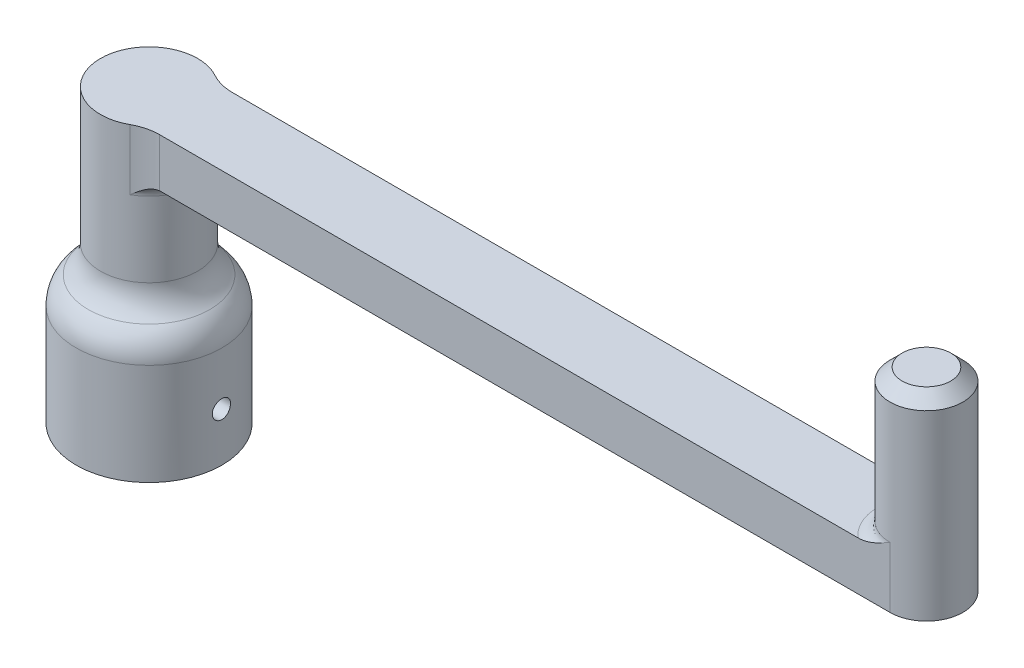
ISO-10303-21;
HEADER;
FILE_DESCRIPTION(('STEP AP214'),'2;1');
FILE_NAME('part.step','',(''),(''),'','','');
FILE_SCHEMA(('AUTOMOTIVE_DESIGN { 1 0 10303 214 1 1 1 1 }'));
ENDSEC;
DATA;
#1=APPLICATION_CONTEXT('core data for automotive mechanical design processes');
#2=APPLICATION_PROTOCOL_DEFINITION('international standard','automotive_design',2000,#1);
#3=PRODUCT_CONTEXT('',#1,'mechanical');
#4=PRODUCT('Part','Part','',(#3));
#5=PRODUCT_RELATED_PRODUCT_CATEGORY('part','',(#4));
#6=PRODUCT_DEFINITION_FORMATION('','',#4);
#7=PRODUCT_DEFINITION_CONTEXT('part definition',#1,'design');
#8=PRODUCT_DEFINITION('design','',#6,#7);
#9=PRODUCT_DEFINITION_SHAPE('','',#8);
#10=(LENGTH_UNIT() NAMED_UNIT(*) SI_UNIT(.MILLI.,.METRE.));
#11=(NAMED_UNIT(*) PLANE_ANGLE_UNIT() SI_UNIT($,.RADIAN.));
#12=(NAMED_UNIT(*) SI_UNIT($,.STERADIAN.) SOLID_ANGLE_UNIT());
#13=UNCERTAINTY_MEASURE_WITH_UNIT(LENGTH_MEASURE(1.E-05),#10,'distance_accuracy_value','');
#14=(GEOMETRIC_REPRESENTATION_CONTEXT(3) GLOBAL_UNCERTAINTY_ASSIGNED_CONTEXT((#13)) GLOBAL_UNIT_ASSIGNED_CONTEXT((#10,
#11,#12)) REPRESENTATION_CONTEXT('',''));
#15=CARTESIAN_POINT('',(0.,0.,0.));
#16=DIRECTION('',(0.,0.,1.));
#17=DIRECTION('',(1.,0.,0.));
#18=AXIS2_PLACEMENT_3D('',#15,#16,#17);
#19=CARTESIAN_POINT('',(0.,38.1,0.));
#20=DIRECTION('',(0.,-1.,0.));
#21=DIRECTION('',(0.,0.,-1.));
#22=AXIS2_PLACEMENT_3D('',#19,#20,#21);
#23=CYLINDRICAL_SURFACE('',#22,6.35);
#24=CARTESIAN_POINT('',(0.,20.3651280605346,0.));
#25=DIRECTION('',(0.,-1.,0.));
#26=DIRECTION('',(0.,0.,-1.));
#27=AXIS2_PLACEMENT_3D('',#24,#25,#26);
#28=CIRCLE('',#27,6.35);
#29=CARTESIAN_POINT('',(0.,20.3651280605346,-6.35));
#30=VERTEX_POINT('',#29);
#31=EDGE_CURVE('E197',#30,#30,#28,.F.);
#32=ORIENTED_EDGE('',*,*,#31,.T.);
#33=EDGE_LOOP('',(#32));
#34=FACE_BOUND('',#33,.T.);
#35=DIRECTION('',(0.,-1.,0.));
#36=VECTOR('',#35,1.);
#37=CARTESIAN_POINT('',(3.07418053105214,38.1,-5.55625));
#38=LINE('',#37,#36);
#39=CARTESIAN_POINT('',(3.07418053105214,38.1,-5.55625));
#40=VERTEX_POINT('',#39);
#41=CARTESIAN_POINT('',(3.07418053105214,30.1625,-5.55625));
#42=VERTEX_POINT('',#41);
#43=EDGE_CURVE('E201',#40,#42,#38,.T.);
#44=ORIENTED_EDGE('',*,*,#43,.T.);
#45=CARTESIAN_POINT('',(0.,30.1625,0.));
#46=DIRECTION('',(0.,1.,0.));
#47=DIRECTION('',(0.,0.,1.));
#48=AXIS2_PLACEMENT_3D('',#45,#46,#47);
#49=CIRCLE('',#48,6.35);
#50=CARTESIAN_POINT('',(3.07418053105214,30.1625,5.55625));
#51=VERTEX_POINT('',#50);
#52=EDGE_CURVE('E204',#42,#51,#49,.F.);
#53=ORIENTED_EDGE('',*,*,#52,.T.);
#54=DIRECTION('',(0.,-1.,0.));
#55=VECTOR('',#54,1.);
#56=CARTESIAN_POINT('',(3.07418053105214,38.1,5.55625));
#57=LINE('',#56,#55);
#58=CARTESIAN_POINT('',(3.07418053105214,38.1,5.55625));
#59=VERTEX_POINT('',#58);
#60=EDGE_CURVE('E208',#51,#59,#57,.F.);
#61=ORIENTED_EDGE('',*,*,#60,.T.);
#62=CARTESIAN_POINT('',(0.,38.1,0.));
#63=DIRECTION('',(0.,1.,0.));
#64=DIRECTION('',(0.,0.,1.));
#65=AXIS2_PLACEMENT_3D('',#62,#63,#64);
#66=CIRCLE('',#65,6.35);
#67=EDGE_CURVE('E207',#40,#59,#66,.T.);
#68=ORIENTED_EDGE('',*,*,#67,.F.);
#69=EDGE_LOOP('',(#44,#53,#61,#68));
#70=FACE_BOUND('',#69,.T.);
#71=ADVANCED_FACE('F29',(#34,#70),#23,.T.);
#72=CARTESIAN_POINT('',(0.,0.,0.));
#73=DIRECTION('',(0.,1.,0.));
#74=DIRECTION('',(0.,0.,1.));
#75=AXIS2_PLACEMENT_3D('',#72,#73,#74);
#76=PLANE('',#75);
#77=CARTESIAN_POINT('',(0.,0.,0.));
#78=DIRECTION('',(0.,1.,0.));
#79=DIRECTION('',(0.,0.,1.));
#80=AXIS2_PLACEMENT_3D('',#77,#78,#79);
#81=CIRCLE('',#80,9.525);
#82=CARTESIAN_POINT('',(0.,0.,9.525));
#83=VERTEX_POINT('',#82);
#84=EDGE_CURVE('E305',#83,#83,#81,.T.);
#85=ORIENTED_EDGE('',*,*,#84,.F.);
#86=EDGE_LOOP('',(#85));
#87=FACE_BOUND('',#86,.T.);
#88=CARTESIAN_POINT('',(0.,0.,0.));
#89=DIRECTION('',(0.,1.,0.));
#90=DIRECTION('',(0.,0.,1.));
#91=AXIS2_PLACEMENT_3D('',#88,#89,#90);
#92=CIRCLE('',#91,6.35);
#93=CARTESIAN_POINT('',(4.7625,0.,-4.20013020631504));
#94=VERTEX_POINT('',#93);
#95=CARTESIAN_POINT('',(4.7625,0.,4.20013020631504));
#96=VERTEX_POINT('',#95);
#97=EDGE_CURVE('E150',#94,#96,#92,.T.);
#98=ORIENTED_EDGE('',*,*,#97,.T.);
#99=DIRECTION('',(0.,0.,-1.));
#100=VECTOR('',#99,1.);
#101=CARTESIAN_POINT('',(4.7625,0.,4.20013020631504));
#102=LINE('',#101,#100);
#103=EDGE_CURVE('E318',#96,#94,#102,.T.);
#104=ORIENTED_EDGE('',*,*,#103,.T.);
#105=EDGE_LOOP('',(#98,#104));
#106=FACE_BOUND('',#105,.T.);
#107=ADVANCED_FACE('F188',(#87,#106),#76,.F.);
#108=CARTESIAN_POINT('',(0.,38.1,0.));
#109=DIRECTION('',(0.,1.,0.));
#110=DIRECTION('',(0.,0.,1.));
#111=AXIS2_PLACEMENT_3D('',#108,#109,#110);
#112=PLANE('',#111);
#113=DIRECTION('',(1.,0.,0.));
#114=VECTOR('',#113,1.);
#115=CARTESIAN_POINT('',(0.,38.1,4.7625));
#116=LINE('',#115,#114);
#117=CARTESIAN_POINT('',(6.14836106210427,38.1,4.7625));
#118=VERTEX_POINT('',#117);
#119=CARTESIAN_POINT('',(97.3998697936849,38.1,4.76250000000001));
#120=VERTEX_POINT('',#119);
#121=EDGE_CURVE('E121',#118,#120,#116,.T.);
#122=ORIENTED_EDGE('',*,*,#121,.T.);
#123=CARTESIAN_POINT('',(101.6,38.1,0.));
#124=DIRECTION('',(0.,1.,0.));
#125=DIRECTION('',(0.,0.,1.));
#126=AXIS2_PLACEMENT_3D('',#123,#124,#125);
#127=CIRCLE('',#126,6.35);
#128=CARTESIAN_POINT('',(97.3998697936849,38.1,-4.76249999999999));
#129=VERTEX_POINT('',#128);
#130=EDGE_CURVE('E222',#120,#129,#127,.F.);
#131=ORIENTED_EDGE('',*,*,#130,.T.);
#132=DIRECTION('',(1.,0.,0.));
#133=VECTOR('',#132,1.);
#134=CARTESIAN_POINT('',(0.,38.1,-4.7625));
#135=LINE('',#134,#133);
#136=CARTESIAN_POINT('',(6.14836106210427,38.1,-4.7625));
#137=VERTEX_POINT('',#136);
#138=EDGE_CURVE('E285',#137,#129,#135,.T.);
#139=ORIENTED_EDGE('',*,*,#138,.F.);
#140=CARTESIAN_POINT('',(6.14836106210427,38.1,-11.1125));
#141=DIRECTION('',(0.,1.,0.));
#142=DIRECTION('',(0.,0.,1.));
#143=AXIS2_PLACEMENT_3D('',#140,#141,#142);
#144=CIRCLE('',#143,6.35);
#145=EDGE_CURVE('E280',#137,#40,#144,.F.);
#146=ORIENTED_EDGE('',*,*,#145,.T.);
#147=ORIENTED_EDGE('',*,*,#67,.T.);
#148=CARTESIAN_POINT('',(6.14836106210427,38.1,11.1125));
#149=DIRECTION('',(0.,1.,0.));
#150=DIRECTION('',(0.,0.,1.));
#151=AXIS2_PLACEMENT_3D('',#148,#149,#150);
#152=CIRCLE('',#151,6.35);
#153=EDGE_CURVE('E293',#59,#118,#152,.F.);
#154=ORIENTED_EDGE('',*,*,#153,.T.);
#155=EDGE_LOOP('',(#122,#131,#139,#146,#147,#154));
#156=FACE_BOUND('',#155,.T.);
#157=ADVANCED_FACE('F185',(#156),#112,.T.);
#158=CARTESIAN_POINT('',(0.,15.875,0.));
#159=DIRECTION('',(0.,-1.,0.));
#160=DIRECTION('',(0.,0.,-1.));
#161=AXIS2_PLACEMENT_3D('',#158,#159,#160);
#162=CYLINDRICAL_SURFACE('',#161,9.525);
#163=CARTESIAN_POINT('',(9.525,5.159375,0.));
#164=CARTESIAN_POINT('',(9.52499907081924,5.15937782937064,0.0665993217584333));
#165=CARTESIAN_POINT('',(9.52429412394272,5.16498183370437,0.133240259761685));
#166=CARTESIAN_POINT('',(9.52154975978035,5.18724884311434,0.264667746995247));
#167=CARTESIAN_POINT('',(9.51950894913981,5.20392339543601,0.32945228620956));
#168=CARTESIAN_POINT('',(9.51432276572398,5.24783255291408,0.455245267504719));
#169=CARTESIAN_POINT('',(9.51117813655702,5.27506005016194,0.5162562192696));
#170=CARTESIAN_POINT('',(9.50413406293194,5.33928666899061,0.63283122491781));
#171=CARTESIAN_POINT('',(9.5002347479881,5.37628411431275,0.688396210941223));
#172=CARTESIAN_POINT('',(9.49209265522138,5.4592181661111,0.792819479063541));
#173=CARTESIAN_POINT('',(9.48784828372264,5.50519780785114,0.841643461301308));
#174=CARTESIAN_POINT('',(9.47950729512144,5.60469866970932,0.930903392931758));
#175=CARTESIAN_POINT('',(9.47541068555933,5.65822027401493,0.971338914756811));
#176=CARTESIAN_POINT('',(9.46781335551327,5.77150863931565,1.04280183931148));
#177=CARTESIAN_POINT('',(9.4643146875598,5.83129581844673,1.07379711069194));
#178=CARTESIAN_POINT('',(9.45833037427971,5.95527783348993,1.1252944902189));
#179=CARTESIAN_POINT('',(9.45584469053881,6.01947250215377,1.14579699627856));
#180=CARTESIAN_POINT('',(9.45218299236221,6.1500912981482,1.1756226392368));
#181=CARTESIAN_POINT('',(9.45100019611749,6.21650200898162,1.18500368539097));
#182=CARTESIAN_POINT('',(9.45005743403004,6.34996488297846,1.19249930547663));
#183=CARTESIAN_POINT('',(9.45029741096968,6.41701702023828,1.1906143324774));
#184=CARTESIAN_POINT('',(9.45216687494844,6.54945579897723,1.17567895885832));
#185=CARTESIAN_POINT('',(9.45378842328606,6.61484976217788,1.16269234837146));
#186=CARTESIAN_POINT('',(9.45822593884571,6.74252287885554,1.12602186999045));
#187=CARTESIAN_POINT('',(9.46104193026775,6.80480196919506,1.10233778535935));
#188=CARTESIAN_POINT('',(9.4675600393054,6.92467563453408,1.04487609790793));
#189=CARTESIAN_POINT('',(9.4712645849195,6.98225678424358,1.01107077457826));
#190=CARTESIAN_POINT('',(9.47914051318822,7.09095293821431,0.93434604982886));
#191=CARTESIAN_POINT('',(9.48331191719172,7.14206764654496,0.891426231533472));
#192=CARTESIAN_POINT('',(9.49168683585315,7.23675021598171,0.79733732649649));
#193=CARTESIAN_POINT('',(9.49589037311756,7.28026345495355,0.746113256233808));
#194=CARTESIAN_POINT('',(9.50382893754725,7.35808260411455,0.637059226790508));
#195=CARTESIAN_POINT('',(9.50756396363217,7.39238849307254,0.57922925237782));
#196=CARTESIAN_POINT('',(9.51414698744098,7.45081916637094,0.45856287098686));
#197=CARTESIAN_POINT('',(9.51699468708732,7.47494053041093,0.39572479052959));
#198=CARTESIAN_POINT('',(9.52147949227754,7.51227407254045,0.266846656630293));
#199=CARTESIAN_POINT('',(9.52311665449633,7.52548676135527,0.200806753245358));
#200=CARTESIAN_POINT('',(9.52498855290624,7.54055709830409,0.0678718943138055));
#201=CARTESIAN_POINT('',(9.5252325821293,7.54248999136339,0.000985594707089094));
#202=CARTESIAN_POINT('',(9.52431580975086,7.53514444165585,-0.13215748738193));
#203=CARTESIAN_POINT('',(9.52315503806674,7.52586623764643,-0.198414283240189));
#204=CARTESIAN_POINT('',(9.51956488620374,7.4964243761962,-0.328195546802372));
#205=CARTESIAN_POINT('',(9.51713968812605,7.4762965964295,-0.391728279164763));
#206=CARTESIAN_POINT('',(9.51129220626469,7.42576423852647,-0.514516523126314));
#207=CARTESIAN_POINT('',(9.50786988862572,7.39535931144346,-0.573771889410353));
#208=CARTESIAN_POINT('',(9.50038655660941,7.32495369326207,-0.686659402977384));
#209=CARTESIAN_POINT('',(9.49632233975245,7.28490432948007,-0.740260978173241));
#210=CARTESIAN_POINT('',(9.48801986532594,7.19641555179934,-0.840008316309531));
#211=CARTESIAN_POINT('',(9.4837816008531,7.14797580486547,-0.886153783157926));
#212=CARTESIAN_POINT('',(9.47558003976556,7.04374984276941,-0.969945970387077));
#213=CARTESIAN_POINT('',(9.47161844586032,6.98792337506968,-1.00754281309548));
#214=CARTESIAN_POINT('',(9.46444677006442,6.87070401088794,-1.07282593859747));
#215=CARTESIAN_POINT('',(9.46123667310901,6.80931122602431,-1.10051242006313));
#216=CARTESIAN_POINT('',(9.45594303749664,6.68286287925595,-1.14510815818519));
#217=CARTESIAN_POINT('',(9.45385656144256,6.61781736343965,-1.16204553632645));
#218=CARTESIAN_POINT('',(9.45103797450925,6.48577769209946,-1.18475283457956));
#219=CARTESIAN_POINT('',(9.4503058006243,6.41878362737453,-1.19052327420765));
#220=CARTESIAN_POINT('',(9.45028055162894,6.28524479746627,-1.1907233628104));
#221=CARTESIAN_POINT('',(9.45097753288118,6.21870013798194,-1.18523137240428));
#222=CARTESIAN_POINT('',(9.45371068298342,6.08748760464941,-1.16322843530949));
#223=CARTESIAN_POINT('',(9.45574685197692,6.02281973100231,-1.14671748744012));
#224=CARTESIAN_POINT('',(9.46092587637629,5.89720676184,-1.1031698188447));
#225=CARTESIAN_POINT('',(9.46406833493563,5.83626034055836,-1.07613687218741));
#226=CARTESIAN_POINT('',(9.47110651770345,5.71975615600949,-1.01232028714908));
#227=CARTESIAN_POINT('',(9.47500225135022,5.66419846027431,-0.97553652659144));
#228=CARTESIAN_POINT('',(9.48314050513251,5.5596482539316,-0.892971765265354));
#229=CARTESIAN_POINT('',(9.48738516580021,5.51070202422019,-0.847132366775322));
#230=CARTESIAN_POINT('',(9.49572411046119,5.42116637451375,-0.747879295593691));
#231=CARTESIAN_POINT('',(9.49981835876249,5.38057892761873,-0.69446383957867));
#232=CARTESIAN_POINT('',(9.50741235699438,5.3087815986786,-0.581342001931816));
#233=CARTESIAN_POINT('',(9.51090978693541,5.27760796494048,-0.521612469407674));
#234=CARTESIAN_POINT('',(9.5168925537279,5.22577794556112,-0.397755857220983));
#235=CARTESIAN_POINT('',(9.5193789896976,5.20511013219917,-0.333633642264448));
#236=CARTESIAN_POINT('',(9.52246025556089,5.17982549019592,-0.224316498899723));
#237=CARTESIAN_POINT('',(9.5234080195771,5.17216757888104,-0.179810884749932));
#238=CARTESIAN_POINT('',(9.52467820420526,5.1619413942386,-0.0902098763549205));
#239=CARTESIAN_POINT('',(9.52500062942852,5.15937308337983,-0.0451144864612313));
#240=CARTESIAN_POINT('',(9.525,5.159375,0.));
#241=B_SPLINE_CURVE_WITH_KNOTS('',3,(#163,#164,#165,#166,#167,#168,#169,#170,#171,#172,#173,
#174,#175,#176,#177,#178,#179,#180,#181,#182,#183,#184,#185,#186,#187,#188,#189,#190,#191,#192,
#193,#194,#195,#196,#197,#198,#199,#200,#201,#202,#203,#204,#205,#206,#207,#208,#209,#210,#211,
#212,#213,#214,#215,#216,#217,#218,#219,#220,#221,#222,#223,#224,#225,#226,#227,#228,#229,#230,
#231,#232,#233,#234,#235,#236,#237,#238,#239,#240),.UNSPECIFIED.,.T.,.F.,(4,2,2,2,2,2,2,2,2,2,2,
2,2,2,2,2,2,2,2,2,2,2,2,2,2,2,2,2,2,2,2,2,2,2,2,2,2,2,4),(0.,0.199633176159688,
0.399474909524307,0.599182273271568,0.798855394877485,0.999509747873776,1.20017432589755,
1.40151445464362,1.60284694747854,1.8031264354261,2.00339786907571,2.20252621680356,
2.40165859916672,2.60134144268485,2.8010334211962,3.00210606462468,3.2031791717012,
3.40431975217177,3.60545091505425,3.80523883060402,4.00502249144044,4.2041495191673,
4.40328330866349,4.60344394394661,4.80361252592386,5.00492063930482,5.20622471685508,
5.4069999537629,5.60776584983809,5.80713961697555,6.00651340547635,6.20581574766465,
6.40512058720716,6.60575531950734,6.80643735771344,7.00788255696301,7.20910816248271,
7.34434099068108,7.47957282165583),.UNSPECIFIED.);
#242=CARTESIAN_POINT('',(9.525,5.159375,0.));
#243=VERTEX_POINT('',#242);
#244=EDGE_CURVE('E143',#243,#243,#241,.T.);
#245=ORIENTED_EDGE('',*,*,#244,.T.);
#246=EDGE_LOOP('',(#245));
#247=FACE_BOUND('',#246,.T.);
#248=CARTESIAN_POINT('',(0.,13.2656122319727,0.));
#249=DIRECTION('',(0.,-1.,0.));
#250=DIRECTION('',(0.,0.,-1.));
#251=AXIS2_PLACEMENT_3D('',#248,#249,#250);
#252=CIRCLE('',#251,9.525);
#253=CARTESIAN_POINT('',(0.,13.2656122319727,-9.525));
#254=VERTEX_POINT('',#253);
#255=EDGE_CURVE('E209',#254,#254,#252,.T.);
#256=ORIENTED_EDGE('',*,*,#255,.T.);
#257=EDGE_LOOP('',(#256));
#258=FACE_BOUND('',#257,.T.);
#259=ORIENTED_EDGE('',*,*,#84,.T.);
#260=EDGE_LOOP('',(#259));
#261=FACE_BOUND('',#260,.T.);
#262=ADVANCED_FACE('F152',(#247,#258,#261),#162,.T.);
#263=CARTESIAN_POINT('',(0.,12.7,0.));
#264=DIRECTION('',(0.,-1.,0.));
#265=DIRECTION('',(0.,0.,-1.));
#266=AXIS2_PLACEMENT_3D('',#263,#264,#265);
#267=CYLINDRICAL_SURFACE('',#266,6.35);
#268=ORIENTED_EDGE('',*,*,#97,.F.);
#269=DIRECTION('',(0.,-1.,0.));
#270=VECTOR('',#269,1.);
#271=CARTESIAN_POINT('',(4.7625,12.7,-4.20013020631504));
#272=LINE('',#271,#270);
#273=CARTESIAN_POINT('',(4.7625,12.7,-4.20013020631504));
#274=VERTEX_POINT('',#273);
#275=EDGE_CURVE('E311',#274,#94,#272,.T.);
#276=ORIENTED_EDGE('',*,*,#275,.F.);
#277=CARTESIAN_POINT('',(0.,12.7,0.));
#278=DIRECTION('',(0.,1.,0.));
#279=DIRECTION('',(0.,0.,1.));
#280=AXIS2_PLACEMENT_3D('',#277,#278,#279);
#281=CIRCLE('',#280,6.35);
#282=CARTESIAN_POINT('',(4.7625,12.7,4.20013020631504));
#283=VERTEX_POINT('',#282);
#284=EDGE_CURVE('E316',#274,#283,#281,.T.);
#285=ORIENTED_EDGE('',*,*,#284,.T.);
#286=DIRECTION('',(0.,-1.,0.));
#287=VECTOR('',#286,1.);
#288=CARTESIAN_POINT('',(4.7625,12.7,4.20013020631504));
#289=LINE('',#288,#287);
#290=EDGE_CURVE('E308',#283,#96,#289,.T.);
#291=ORIENTED_EDGE('',*,*,#290,.T.);
#292=EDGE_LOOP('',(#268,#276,#285,#291));
#293=FACE_BOUND('',#292,.T.);
#294=ADVANCED_FACE('F178',(#293),#267,.F.);
#295=CARTESIAN_POINT('',(4.7625,12.7,4.20013020631504));
#296=DIRECTION('',(-1.,0.,0.));
#297=DIRECTION('',(0.,0.,1.));
#298=AXIS2_PLACEMENT_3D('',#295,#296,#297);
#299=PLANE('',#298);
#300=CARTESIAN_POINT('',(4.7625,6.35,0.));
#301=DIRECTION('',(-1.,0.,0.));
#302=DIRECTION('',(0.,0.,1.));
#303=AXIS2_PLACEMENT_3D('',#300,#301,#302);
#304=CIRCLE('',#303,1.190625);
#305=CARTESIAN_POINT('',(4.7625,6.35,1.190625));
#306=VERTEX_POINT('',#305);
#307=EDGE_CURVE('E132',#306,#306,#304,.T.);
#308=ORIENTED_EDGE('',*,*,#307,.F.);
#309=EDGE_LOOP('',(#308));
#310=FACE_BOUND('',#309,.T.);
#311=ORIENTED_EDGE('',*,*,#103,.F.);
#312=ORIENTED_EDGE('',*,*,#290,.F.);
#313=DIRECTION('',(0.,0.,-1.));
#314=VECTOR('',#313,1.);
#315=CARTESIAN_POINT('',(4.7625,12.7,4.20013020631504));
#316=LINE('',#315,#314);
#317=EDGE_CURVE('E314',#283,#274,#316,.T.);
#318=ORIENTED_EDGE('',*,*,#317,.T.);
#319=ORIENTED_EDGE('',*,*,#275,.T.);
#320=EDGE_LOOP('',(#311,#312,#318,#319));
#321=FACE_BOUND('',#320,.T.);
#322=ADVANCED_FACE('F175',(#310,#321),#299,.T.);
#323=CARTESIAN_POINT('',(0.,12.7,0.));
#324=DIRECTION('',(0.,1.,0.));
#325=DIRECTION('',(0.,0.,1.));
#326=AXIS2_PLACEMENT_3D('',#323,#324,#325);
#327=PLANE('',#326);
#328=ORIENTED_EDGE('',*,*,#284,.F.);
#329=ORIENTED_EDGE('',*,*,#317,.F.);
#330=EDGE_LOOP('',(#328,#329));
#331=FACE_BOUND('',#330,.T.);
#332=ADVANCED_FACE('F171',(#331),#327,.F.);
#333=CARTESIAN_POINT('',(0.,20.3651280605346,0.));
#334=DIRECTION('',(0.,-1.,0.));
#335=DIRECTION('',(0.,0.,-1.));
#336=AXIS2_PLACEMENT_3D('',#333,#334,#335);
#337=TOROIDAL_SURFACE('',#336,11.1125,4.7625);
#338=CARTESIAN_POINT('',(0.,16.8153701462537,0.));
#339=DIRECTION('',(0.,1.,0.));
#340=DIRECTION('',(0.,0.,1.));
#341=AXIS2_PLACEMENT_3D('',#338,#339,#340);
#342=CIRCLE('',#341,7.9375);
#343=CARTESIAN_POINT('',(0.,16.8153701462537,7.9375));
#344=VERTEX_POINT('',#343);
#345=EDGE_CURVE('E300',#344,#344,#342,.T.);
#346=ORIENTED_EDGE('',*,*,#345,.T.);
#347=EDGE_LOOP('',(#346));
#348=FACE_BOUND('',#347,.T.);
#349=ORIENTED_EDGE('',*,*,#31,.F.);
#350=EDGE_LOOP('',(#349));
#351=FACE_BOUND('',#350,.T.);
#352=ADVANCED_FACE('F167',(#348,#351),#337,.F.);
#353=CARTESIAN_POINT('',(0.,13.2656122319727,0.));
#354=DIRECTION('',(0.,-1.,0.));
#355=DIRECTION('',(0.,0.,-1.));
#356=AXIS2_PLACEMENT_3D('',#353,#354,#355);
#357=DEGENERATE_TOROIDAL_SURFACE('',#356,4.7625,4.7625,.T.);
#358=ORIENTED_EDGE('',*,*,#255,.F.);
#359=EDGE_LOOP('',(#358));
#360=FACE_BOUND('',#359,.T.);
#361=ORIENTED_EDGE('',*,*,#345,.F.);
#362=EDGE_LOOP('',(#361));
#363=FACE_BOUND('',#362,.T.);
#364=ADVANCED_FACE('F161',(#360,#363),#357,.T.);
#365=CARTESIAN_POINT('',(9.525,6.35,0.));
#366=DIRECTION('',(-1.,0.,0.));
#367=DIRECTION('',(0.,0.,1.));
#368=AXIS2_PLACEMENT_3D('',#365,#366,#367);
#369=CYLINDRICAL_SURFACE('',#368,1.190625);
#370=ORIENTED_EDGE('',*,*,#307,.T.);
#371=EDGE_LOOP('',(#370));
#372=FACE_BOUND('',#371,.T.);
#373=ORIENTED_EDGE('',*,*,#244,.F.);
#374=EDGE_LOOP('',(#373));
#375=FACE_BOUND('',#374,.T.);
#376=ADVANCED_FACE('F156',(#372,#375),#369,.F.);
#377=CARTESIAN_POINT('',(101.6,31.75,0.));
#378=DIRECTION('',(0.,1.,0.));
#379=DIRECTION('',(0.,0.,1.));
#380=AXIS2_PLACEMENT_3D('',#377,#378,#379);
#381=PLANE('',#380);
#382=DIRECTION('',(1.,0.,0.));
#383=VECTOR('',#382,1.);
#384=CARTESIAN_POINT('',(0.,31.75,4.7625));
#385=LINE('',#384,#383);
#386=CARTESIAN_POINT('',(6.35,31.75,4.7625));
#387=VERTEX_POINT('',#386);
#388=CARTESIAN_POINT('',(101.6,31.75,4.76250000000001));
#389=VERTEX_POINT('',#388);
#390=EDGE_CURVE('E137',#387,#389,#385,.T.);
#391=ORIENTED_EDGE('',*,*,#390,.F.);
#392=CARTESIAN_POINT('',(0.,31.75,0.));
#393=DIRECTION('',(0.,1.,0.));
#394=DIRECTION('',(0.,0.,1.));
#395=AXIS2_PLACEMENT_3D('',#392,#393,#394);
#396=CIRCLE('',#395,7.9375);
#397=CARTESIAN_POINT('',(6.35,31.75,-4.7625));
#398=VERTEX_POINT('',#397);
#399=EDGE_CURVE('E119',#387,#398,#396,.T.);
#400=ORIENTED_EDGE('',*,*,#399,.T.);
#401=DIRECTION('',(1.,0.,0.));
#402=VECTOR('',#401,1.);
#403=CARTESIAN_POINT('',(0.,31.75,-4.7625));
#404=LINE('',#403,#402);
#405=CARTESIAN_POINT('',(101.6,31.75,-4.76249999999999));
#406=VERTEX_POINT('',#405);
#407=EDGE_CURVE('E112',#398,#406,#404,.T.);
#408=ORIENTED_EDGE('',*,*,#407,.T.);
#409=CARTESIAN_POINT('',(101.6,31.75,0.));
#410=DIRECTION('',(0.,1.,0.));
#411=DIRECTION('',(0.,0.,1.));
#412=AXIS2_PLACEMENT_3D('',#409,#410,#411);
#413=CIRCLE('',#412,4.7625);
#414=EDGE_CURVE('E117',#389,#406,#413,.T.);
#415=ORIENTED_EDGE('',*,*,#414,.F.);
#416=EDGE_LOOP('',(#391,#400,#408,#415));
#417=FACE_BOUND('',#416,.T.);
#418=ADVANCED_FACE('F115',(#417),#381,.F.);
#419=CARTESIAN_POINT('',(0.,31.75,-4.7625));
#420=DIRECTION('',(0.,0.,1.));
#421=DIRECTION('',(1.,0.,0.));
#422=AXIS2_PLACEMENT_3D('',#419,#420,#421);
#423=PLANE('',#422);
#424=ORIENTED_EDGE('',*,*,#407,.F.);
#425=CARTESIAN_POINT('',(6.35,31.75,-4.7625));
#426=CARTESIAN_POINT('',(6.31633922220832,31.7499923867917,-4.7625));
#427=CARTESIAN_POINT('',(6.28270554805562,31.7493118181252,-4.7625));
#428=CARTESIAN_POINT('',(6.21549256901834,31.7466047763999,-4.7625));
#429=CARTESIAN_POINT('',(6.18191326387246,31.7445783098287,-4.7625));
#430=CARTESIAN_POINT('',(6.14836106210427,31.7418788942867,-4.7625));
#431=B_SPLINE_CURVE_WITH_KNOTS('',3,(#425,#426,#427,#428,#429,#430),.UNSPECIFIED.,.F.,.F.,(4,2,
4),(0.,0.100921677039571,0.201842867617153),.UNSPECIFIED.);
#432=CARTESIAN_POINT('',(6.14836106210427,31.7418788942867,-4.7625));
#433=VERTEX_POINT('',#432);
#434=EDGE_CURVE('E215',#398,#433,#431,.T.);
#435=ORIENTED_EDGE('',*,*,#434,.T.);
#436=DIRECTION('',(0.,1.,0.));
#437=VECTOR('',#436,1.);
#438=CARTESIAN_POINT('',(6.14836106210427,38.1,-4.7625));
#439=LINE('',#438,#437);
#440=EDGE_CURVE('E55',#433,#137,#439,.T.);
#441=ORIENTED_EDGE('',*,*,#440,.T.);
#442=ORIENTED_EDGE('',*,*,#138,.T.);
#443=CARTESIAN_POINT('',(97.3998697936849,38.1,-4.76249999999999));
#444=CARTESIAN_POINT('',(97.5198682397588,38.1000308471907,-4.76249999999999));
#445=CARTESIAN_POINT('',(97.6397037209687,38.1059456327167,-4.76249999999999));
#446=CARTESIAN_POINT('',(97.8781900344713,38.1280174984844,-4.76249999999999));
#447=CARTESIAN_POINT('',(97.9968428516339,38.1441526557439,-4.76249999999999));
#448=CARTESIAN_POINT('',(98.3470869244978,38.2050568375384,-4.76249999999999));
#449=CARTESIAN_POINT('',(98.576478464973,38.2624166386697,-4.76249999999999));
#450=CARTESIAN_POINT('',(99.0479939916406,38.4080180003787,-4.76249999999999));
#451=CARTESIAN_POINT('',(99.2893534412874,38.498611286133,-4.76249999999999));
#452=CARTESIAN_POINT('',(99.7637324653928,38.6997063020515,-4.76249999999999));
#453=CARTESIAN_POINT('',(99.9967420763301,38.8102309255095,-4.76249999999999));
#454=CARTESIAN_POINT('',(100.689162805656,39.161663130343,-4.76249999999999));
#455=CARTESIAN_POINT('',(101.138805120358,39.4212293103681,-4.76249999999999));
#456=CARTESIAN_POINT('',(101.592031333592,39.6828993075147,-4.76249999999999));
#457=CARTESIAN_POINT('',(101.596015678163,39.6851996701978,-4.76249999999999));
#458=CARTESIAN_POINT('',(101.6,39.6875,-4.76249999999999));
#459=B_SPLINE_CURVE_WITH_KNOTS('',3,(#443,#444,#445,#446,#447,#448,#449,#450,#451,#452,#453,
#454,#455,#456,#457,#458),.UNSPECIFIED.,.F.,.F.,(4,2,2,2,2,2,2,4),(0.,0.35960641872697,
0.718444071804567,1.42568925542461,2.19786526289622,2.97093391348231,4.52714090342898,
4.54094307718499),.UNSPECIFIED.);
#460=CARTESIAN_POINT('',(101.6,39.6875,-4.76249999999999));
#461=VERTEX_POINT('',#460);
#462=EDGE_CURVE('E128',#129,#461,#459,.T.);
#463=ORIENTED_EDGE('',*,*,#462,.T.);
#464=DIRECTION('',(0.,1.,0.));
#465=VECTOR('',#464,1.);
#466=CARTESIAN_POINT('',(101.6,31.75,-4.76249999999999));
#467=LINE('',#466,#465);
#468=EDGE_CURVE('E124',#406,#461,#467,.T.);
#469=ORIENTED_EDGE('',*,*,#468,.F.);
#470=EDGE_LOOP('',(#424,#435,#441,#442,#463,#469));
#471=FACE_BOUND('',#470,.T.);
#472=ADVANCED_FACE('F125',(#471),#423,.F.);
#473=CARTESIAN_POINT('',(0.,31.75,4.7625));
#474=DIRECTION('',(0.,0.,1.));
#475=DIRECTION('',(1.,0.,0.));
#476=AXIS2_PLACEMENT_3D('',#473,#474,#475);
#477=PLANE('',#476);
#478=ORIENTED_EDGE('',*,*,#121,.F.);
#479=DIRECTION('',(0.,-1.,0.));
#480=VECTOR('',#479,1.);
#481=CARTESIAN_POINT('',(6.14836106210427,31.75,4.7625));
#482=LINE('',#481,#480);
#483=CARTESIAN_POINT('',(6.14836106210427,31.7418788942867,4.7625));
#484=VERTEX_POINT('',#483);
#485=EDGE_CURVE('E47',#118,#484,#482,.T.);
#486=ORIENTED_EDGE('',*,*,#485,.T.);
#487=CARTESIAN_POINT('',(6.14836106210427,31.7418788942867,4.7625));
#488=CARTESIAN_POINT('',(6.18191326387246,31.7445783098287,4.7625));
#489=CARTESIAN_POINT('',(6.21549256901833,31.7466047763999,4.7625));
#490=CARTESIAN_POINT('',(6.28270554805562,31.7493118181252,4.7625));
#491=CARTESIAN_POINT('',(6.31633922220832,31.7499923867917,4.7625));
#492=CARTESIAN_POINT('',(6.35,31.75,4.7625));
#493=B_SPLINE_CURVE_WITH_KNOTS('',3,(#487,#488,#489,#490,#491,#492),.UNSPECIFIED.,.F.,.F.,(4,2,
4),(0.,0.100921190577583,0.201842867617153),.UNSPECIFIED.);
#494=EDGE_CURVE('E11',#484,#387,#493,.T.);
#495=ORIENTED_EDGE('',*,*,#494,.T.);
#496=ORIENTED_EDGE('',*,*,#390,.T.);
#497=DIRECTION('',(0.,1.,0.));
#498=VECTOR('',#497,1.);
#499=CARTESIAN_POINT('',(101.6,31.75,4.76250000000001));
#500=LINE('',#499,#498);
#501=CARTESIAN_POINT('',(101.6,39.6875,4.76250000000001));
#502=VERTEX_POINT('',#501);
#503=EDGE_CURVE('E133',#389,#502,#500,.T.);
#504=ORIENTED_EDGE('',*,*,#503,.T.);
#505=CARTESIAN_POINT('',(97.3998697936849,38.1,4.76250000000002));
#506=CARTESIAN_POINT('',(97.5198682397588,38.1000308471907,4.76250000000001));
#507=CARTESIAN_POINT('',(97.6397037209687,38.1059456327167,4.76250000000001));
#508=CARTESIAN_POINT('',(97.8781900344713,38.1280174984844,4.76250000000001));
#509=CARTESIAN_POINT('',(97.9968428516339,38.1441526557439,4.76250000000001));
#510=CARTESIAN_POINT('',(98.3470869244978,38.2050568375384,4.76250000000001));
#511=CARTESIAN_POINT('',(98.576478464973,38.2624166386697,4.76250000000001));
#512=CARTESIAN_POINT('',(99.0479939916406,38.4080180003787,4.76250000000001));
#513=CARTESIAN_POINT('',(99.2893534412874,38.498611286133,4.76250000000001));
#514=CARTESIAN_POINT('',(99.7637324653928,38.6997063020515,4.76250000000001));
#515=CARTESIAN_POINT('',(99.9967420763301,38.8102309255095,4.76250000000001));
#516=CARTESIAN_POINT('',(100.689162805656,39.161663130343,4.76250000000001));
#517=CARTESIAN_POINT('',(101.138805120358,39.4212293103681,4.76250000000001));
#518=CARTESIAN_POINT('',(101.592031333592,39.6828993075147,4.76250000000001));
#519=CARTESIAN_POINT('',(101.596015678163,39.6851996701978,4.76250000000001));
#520=CARTESIAN_POINT('',(101.6,39.6875,4.76250000000001));
#521=B_SPLINE_CURVE_WITH_KNOTS('',3,(#505,#506,#507,#508,#509,#510,#511,#512,#513,#514,#515,
#516,#517,#518,#519,#520),.UNSPECIFIED.,.F.,.F.,(4,2,2,2,2,2,2,4),(0.,0.35960641872697,
0.718444071804567,1.42568925542461,2.19786526289622,2.97093391348231,4.52714090342898,
4.54094307718499),.UNSPECIFIED.);
#522=EDGE_CURVE('E219',#502,#120,#521,.F.);
#523=ORIENTED_EDGE('',*,*,#522,.T.);
#524=EDGE_LOOP('',(#478,#486,#495,#496,#504,#523));
#525=FACE_BOUND('',#524,.T.);
#526=ADVANCED_FACE('F234',(#525),#477,.T.);
#527=CARTESIAN_POINT('',(101.6,31.75,0.));
#528=DIRECTION('',(0.,1.,0.));
#529=DIRECTION('',(0.,0.,1.));
#530=AXIS2_PLACEMENT_3D('',#527,#528,#529);
#531=CYLINDRICAL_SURFACE('',#530,4.7625);
#532=CARTESIAN_POINT('',(101.6,55.5625,0.));
#533=DIRECTION('',(0.,1.,0.));
#534=DIRECTION('',(0.,0.,1.));
#535=AXIS2_PLACEMENT_3D('',#532,#533,#534);
#536=CIRCLE('',#535,4.7625);
#537=CARTESIAN_POINT('',(101.6,55.5625,4.76250000000001));
#538=VERTEX_POINT('',#537);
#539=EDGE_CURVE('E272',#538,#538,#536,.F.);
#540=ORIENTED_EDGE('',*,*,#539,.T.);
#541=EDGE_LOOP('',(#540));
#542=FACE_BOUND('',#541,.T.);
#543=CARTESIAN_POINT('',(101.6,39.6875,0.));
#544=DIRECTION('',(0.,1.,0.));
#545=DIRECTION('',(0.,0.,1.));
#546=AXIS2_PLACEMENT_3D('',#543,#544,#545);
#547=CIRCLE('',#546,4.7625);
#548=EDGE_CURVE('E271',#461,#502,#547,.T.);
#549=ORIENTED_EDGE('',*,*,#548,.T.);
#550=ORIENTED_EDGE('',*,*,#503,.F.);
#551=ORIENTED_EDGE('',*,*,#414,.T.);
#552=ORIENTED_EDGE('',*,*,#468,.T.);
#553=EDGE_LOOP('',(#549,#550,#551,#552));
#554=FACE_BOUND('',#553,.T.);
#555=ADVANCED_FACE('F136',(#542,#554),#531,.T.);
#556=CARTESIAN_POINT('',(6.14836106210427,38.1,11.1125));
#557=DIRECTION('',(0.,-1.,0.));
#558=DIRECTION('',(0.,0.,-1.));
#559=AXIS2_PLACEMENT_3D('',#556,#557,#558);
#560=CYLINDRICAL_SURFACE('',#559,6.35);
#561=ORIENTED_EDGE('',*,*,#60,.F.);
#562=CARTESIAN_POINT('',(6.14836106210427,31.7418788942867,4.7625));
#563=CARTESIAN_POINT('',(6.06599127320261,31.7352568323256,4.76249222433326));
#564=CARTESIAN_POINT('',(5.98404470746236,31.7247721395622,4.76410280381742));
#565=CARTESIAN_POINT('',(5.82158872719937,31.6970939457911,4.77039554961493));
#566=CARTESIAN_POINT('',(5.74107649265568,31.6799156008085,4.77507079300038));
#567=CARTESIAN_POINT('',(5.50389853286623,31.6202565466237,4.79331381297038));
#568=CARTESIAN_POINT('',(5.34963530958831,31.5694478940137,4.81110707767045));
#569=CARTESIAN_POINT('',(5.07308687504449,31.4612130322835,4.85289426843427));
#570=CARTESIAN_POINT('',(4.94961633298028,31.4061225004467,4.87545298257357));
#571=CARTESIAN_POINT('',(4.70811260078069,31.2874384829001,4.92675687459911));
#572=CARTESIAN_POINT('',(4.59008252337955,31.223840208768,4.95550554197889));
#573=CARTESIAN_POINT('',(4.35847466177577,31.0900275832146,5.01878867359764));
#574=CARTESIAN_POINT('',(4.24492918456161,31.0197744937544,5.05335805663783));
#575=CARTESIAN_POINT('',(4.02256210364076,30.8748412749998,5.12775142264265));
#576=CARTESIAN_POINT('',(3.91373918968622,30.8001623873969,5.16757393560921));
#577=CARTESIAN_POINT('',(3.68090721534718,30.6341020061733,5.25992975143693));
#578=CARTESIAN_POINT('',(3.55770968771864,30.5421417964099,5.31345942726363));
#579=CARTESIAN_POINT('',(3.3164160326086,30.3564550038534,5.42740158230793));
#580=CARTESIAN_POINT('',(3.19830917944065,30.2627327993236,5.48779850577718));
#581=CARTESIAN_POINT('',(3.07954911208818,30.1668375961106,5.55328220043739));
#582=CARTESIAN_POINT('',(3.07686427967953,30.1646687931213,5.55476513415009));
#583=CARTESIAN_POINT('',(3.07418053105214,30.1625,5.55625));
#584=B_SPLINE_CURVE_WITH_KNOTS('',3,(#562,#563,#564,#565,#566,#567,#568,#569,#570,#571,#572,
#573,#574,#575,#576,#577,#578,#579,#580,#581,#582,#583),.UNSPECIFIED.,.F.,.F.,(4,2,2,2,2,2,2,2,
2,2,4),(0.,0.247625087930234,0.494692721509688,0.983002894730366,1.39369335957114,
1.80461595403809,2.21809777148835,2.63146412764484,3.11956566644421,3.60658278976644,
3.61785221940794),.UNSPECIFIED.);
#585=EDGE_CURVE('E41',#51,#484,#584,.F.);
#586=ORIENTED_EDGE('',*,*,#585,.T.);
#587=ORIENTED_EDGE('',*,*,#485,.F.);
#588=ORIENTED_EDGE('',*,*,#153,.F.);
#589=EDGE_LOOP('',(#561,#586,#587,#588));
#590=FACE_BOUND('',#589,.T.);
#591=ADVANCED_FACE('F255',(#590),#560,.F.);
#592=CARTESIAN_POINT('',(6.14836106210427,38.1,-11.1125));
#593=DIRECTION('',(0.,-1.,0.));
#594=DIRECTION('',(0.,0.,-1.));
#595=AXIS2_PLACEMENT_3D('',#592,#593,#594);
#596=CYLINDRICAL_SURFACE('',#595,6.35);
#597=ORIENTED_EDGE('',*,*,#440,.F.);
#598=CARTESIAN_POINT('',(6.14836106210427,31.7418788942867,-4.7625));
#599=CARTESIAN_POINT('',(6.06599127320256,31.7352568323256,-4.76249222433326));
#600=CARTESIAN_POINT('',(5.98404470746226,31.7247721395622,-4.76410280381743));
#601=CARTESIAN_POINT('',(5.82158872719916,31.6970939457911,-4.77039554961494));
#602=CARTESIAN_POINT('',(5.74107649265541,31.6799156008085,-4.7750707930004));
#603=CARTESIAN_POINT('',(5.50389853286602,31.6202565466236,-4.79331381297041));
#604=CARTESIAN_POINT('',(5.34963530958821,31.5694478940137,-4.81110707767046));
#605=CARTESIAN_POINT('',(5.07308687504452,31.4612130322835,-4.85289426843427));
#606=CARTESIAN_POINT('',(4.94961633298036,31.4061225004467,-4.87545298257356));
#607=CARTESIAN_POINT('',(4.70811260078083,31.2874384829002,-4.92675687459908));
#608=CARTESIAN_POINT('',(4.59008252337971,31.2238402087681,-4.95550554197886));
#609=CARTESIAN_POINT('',(4.35847466177593,31.0900275832146,-5.01878867359759));
#610=CARTESIAN_POINT('',(4.24492918456176,31.0197744937544,-5.05335805663777));
#611=CARTESIAN_POINT('',(4.02256210364077,30.8748412749999,-5.12775142264265));
#612=CARTESIAN_POINT('',(3.91373918968612,30.8001623873971,-5.16757393560927));
#613=CARTESIAN_POINT('',(3.68090721534732,30.6341020061731,-5.25992975143685));
#614=CARTESIAN_POINT('',(3.55770968771922,30.542141796409,-5.31345942726331));
#615=CARTESIAN_POINT('',(3.31641603260799,30.3564550038544,-5.42740158230826));
#616=CARTESIAN_POINT('',(3.19830917943842,30.2627327993272,-5.4877985057784));
#617=CARTESIAN_POINT('',(3.07954911208808,30.1668375961108,-5.55328220043745));
#618=CARTESIAN_POINT('',(3.07686427967948,30.1646687931214,-5.55476513415012));
#619=CARTESIAN_POINT('',(3.07418053105214,30.1625,-5.55625));
#620=B_SPLINE_CURVE_WITH_KNOTS('',3,(#598,#599,#600,#601,#602,#603,#604,#605,#606,#607,#608,
#609,#610,#611,#612,#613,#614,#615,#616,#617,#618,#619),.UNSPECIFIED.,.F.,.F.,(4,2,2,2,2,2,2,2,
2,2,4),(0.,0.247625087930396,0.494692721510021,0.983002894730368,1.39369335957101,
1.80461595403786,2.21809777148826,2.63146412764485,3.11956566644424,3.60658278976644,
3.61785221940794),.UNSPECIFIED.);
#621=EDGE_CURVE('E212',#433,#42,#620,.T.);
#622=ORIENTED_EDGE('',*,*,#621,.T.);
#623=ORIENTED_EDGE('',*,*,#43,.F.);
#624=ORIENTED_EDGE('',*,*,#145,.F.);
#625=EDGE_LOOP('',(#597,#622,#623,#624));
#626=FACE_BOUND('',#625,.T.);
#627=ADVANCED_FACE('F213',(#626),#596,.F.);
#628=CARTESIAN_POINT('',(101.6,57.15,0.));
#629=DIRECTION('',(0.,1.,0.));
#630=DIRECTION('',(0.,0.,1.));
#631=AXIS2_PLACEMENT_3D('',#628,#629,#630);
#632=PLANE('',#631);
#633=CARTESIAN_POINT('',(101.6,57.15,0.));
#634=DIRECTION('',(0.,1.,0.));
#635=DIRECTION('',(0.,0.,1.));
#636=AXIS2_PLACEMENT_3D('',#633,#634,#635);
#637=CIRCLE('',#636,3.17499999999997);
#638=CARTESIAN_POINT('',(101.6,57.15,3.17499999999998));
#639=VERTEX_POINT('',#638);
#640=EDGE_CURVE('E275',#639,#639,#637,.T.);
#641=ORIENTED_EDGE('',*,*,#640,.T.);
#642=EDGE_LOOP('',(#641));
#643=FACE_BOUND('',#642,.T.);
#644=ADVANCED_FACE('F247',(#643),#632,.T.);
#645=CARTESIAN_POINT('',(101.6,57.15,0.));
#646=DIRECTION('',(0.,-1.,0.));
#647=DIRECTION('',(0.,0.,-1.));
#648=AXIS2_PLACEMENT_3D('',#645,#646,#647);
#649=CONICAL_SURFACE('',#648,3.17499999999997,0.785398163397453);
#650=ORIENTED_EDGE('',*,*,#539,.F.);
#651=EDGE_LOOP('',(#650));
#652=FACE_BOUND('',#651,.T.);
#653=ORIENTED_EDGE('',*,*,#640,.F.);
#654=EDGE_LOOP('',(#653));
#655=FACE_BOUND('',#654,.T.);
#656=ADVANCED_FACE('F241',(#652,#655),#649,.T.);
#657=CARTESIAN_POINT('',(101.6,39.6875,0.));
#658=DIRECTION('',(0.,1.,0.));
#659=DIRECTION('',(0.,0.,1.));
#660=AXIS2_PLACEMENT_3D('',#657,#658,#659);
#661=TOROIDAL_SURFACE('',#660,6.35,1.5875);
#662=ORIENTED_EDGE('',*,*,#462,.F.);
#663=ORIENTED_EDGE('',*,*,#130,.F.);
#664=ORIENTED_EDGE('',*,*,#522,.F.);
#665=ORIENTED_EDGE('',*,*,#548,.F.);
#666=EDGE_LOOP('',(#662,#663,#664,#665));
#667=FACE_BOUND('',#666,.T.);
#668=ADVANCED_FACE('F237',(#667),#661,.F.);
#669=CARTESIAN_POINT('',(0.,30.1625,0.));
#670=DIRECTION('',(0.,1.,0.));
#671=DIRECTION('',(0.,0.,1.));
#672=AXIS2_PLACEMENT_3D('',#669,#670,#671);
#673=TOROIDAL_SURFACE('',#672,7.9375,1.5875);
#674=ORIENTED_EDGE('',*,*,#585,.F.);
#675=ORIENTED_EDGE('',*,*,#52,.F.);
#676=ORIENTED_EDGE('',*,*,#621,.F.);
#677=ORIENTED_EDGE('',*,*,#434,.F.);
#678=ORIENTED_EDGE('',*,*,#399,.F.);
#679=ORIENTED_EDGE('',*,*,#494,.F.);
#680=EDGE_LOOP('',(#674,#675,#676,#677,#678,#679));
#681=FACE_BOUND('',#680,.T.);
#682=ADVANCED_FACE('F217',(#681),#673,.F.);
#683=CLOSED_SHELL('',(#71,#107,#157,#262,#294,#322,#332,#352,#364,#376,#418,#472,#526,#555,#591,
#627,#644,#656,#668,#682));
#684=MANIFOLD_SOLID_BREP('B2',#683);
#685=ADVANCED_BREP_SHAPE_REPRESENTATION('',(#18,#684),#14);
#686=SHAPE_DEFINITION_REPRESENTATION(#9,#685);
ENDSEC;
END-ISO-10303-21;
